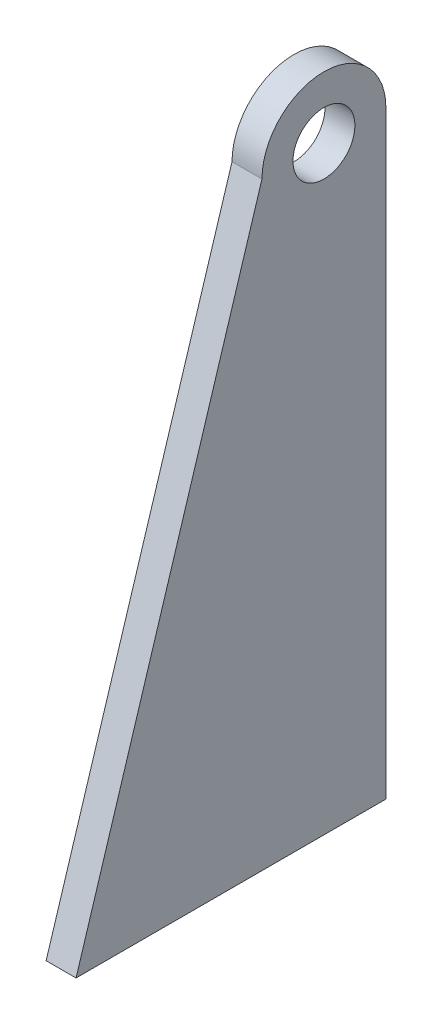
ISO-10303-21;
HEADER;
FILE_DESCRIPTION(('STEP AP214'),'2;1');
FILE_NAME('part.step','',(''),(''),'','','');
FILE_SCHEMA(('AUTOMOTIVE_DESIGN { 1 0 10303 214 1 1 1 1 }'));
ENDSEC;
DATA;
#1=APPLICATION_CONTEXT('core data for automotive mechanical design processes');
#2=APPLICATION_PROTOCOL_DEFINITION('international standard','automotive_design',2000,#1);
#3=PRODUCT_CONTEXT('',#1,'mechanical');
#4=PRODUCT('Part','Part','',(#3));
#5=PRODUCT_RELATED_PRODUCT_CATEGORY('part','',(#4));
#6=PRODUCT_DEFINITION_FORMATION('','',#4);
#7=PRODUCT_DEFINITION_CONTEXT('part definition',#1,'design');
#8=PRODUCT_DEFINITION('design','',#6,#7);
#9=PRODUCT_DEFINITION_SHAPE('','',#8);
#10=(LENGTH_UNIT() NAMED_UNIT(*) SI_UNIT(.MILLI.,.METRE.));
#11=(NAMED_UNIT(*) PLANE_ANGLE_UNIT() SI_UNIT($,.RADIAN.));
#12=(NAMED_UNIT(*) SI_UNIT($,.STERADIAN.) SOLID_ANGLE_UNIT());
#13=UNCERTAINTY_MEASURE_WITH_UNIT(LENGTH_MEASURE(1.E-05),#10,'distance_accuracy_value','');
#14=(GEOMETRIC_REPRESENTATION_CONTEXT(3) GLOBAL_UNCERTAINTY_ASSIGNED_CONTEXT((#13)) GLOBAL_UNIT_ASSIGNED_CONTEXT((#10,
#11,#12)) REPRESENTATION_CONTEXT('',''));
#15=CARTESIAN_POINT('',(0.,0.,0.));
#16=DIRECTION('',(0.,0.,1.));
#17=DIRECTION('',(1.,0.,0.));
#18=AXIS2_PLACEMENT_3D('',#15,#16,#17);
#19=CARTESIAN_POINT('',(5.8,116.,-48.));
#20=DIRECTION('',(1.,0.,0.));
#21=DIRECTION('',(0.,0.,-1.));
#22=AXIS2_PLACEMENT_3D('',#19,#20,#21);
#23=PLANE('',#22);
#24=DIRECTION('',(0.,-0.955064136811237,0.296399214872453));
#25=VECTOR('',#24,1.);
#26=CARTESIAN_POINT('',(5.8,116.,-36.));
#27=LINE('',#26,#25);
#28=CARTESIAN_POINT('',(5.8,116.,-36.));
#29=VERTEX_POINT('',#28);
#30=CARTESIAN_POINT('',(5.8,0.,0.));
#31=VERTEX_POINT('',#30);
#32=EDGE_CURVE('E98',#29,#31,#27,.T.);
#33=ORIENTED_EDGE('',*,*,#32,.T.);
#34=DIRECTION('',(0.,0.,-1.));
#35=VECTOR('',#34,1.);
#36=CARTESIAN_POINT('',(5.8,0.,0.));
#37=LINE('',#36,#35);
#38=CARTESIAN_POINT('',(5.8,0.,-60.));
#39=VERTEX_POINT('',#38);
#40=EDGE_CURVE('E93',#31,#39,#37,.T.);
#41=ORIENTED_EDGE('',*,*,#40,.T.);
#42=DIRECTION('',(0.,1.,0.));
#43=VECTOR('',#42,1.);
#44=CARTESIAN_POINT('',(5.8,0.,-60.));
#45=LINE('',#44,#43);
#46=CARTESIAN_POINT('',(5.8,116.,-60.));
#47=VERTEX_POINT('',#46);
#48=EDGE_CURVE('E96',#39,#47,#45,.T.);
#49=ORIENTED_EDGE('',*,*,#48,.T.);
#50=CARTESIAN_POINT('',(5.8,116.,-48.));
#51=DIRECTION('',(1.,0.,0.));
#52=DIRECTION('',(0.,0.,-1.));
#53=AXIS2_PLACEMENT_3D('',#50,#51,#52);
#54=CIRCLE('',#53,12.);
#55=EDGE_CURVE('E63',#47,#29,#54,.T.);
#56=ORIENTED_EDGE('',*,*,#55,.T.);
#57=EDGE_LOOP('',(#33,#41,#49,#56));
#58=FACE_BOUND('',#57,.T.);
#59=CARTESIAN_POINT('',(5.8,116.,-48.));
#60=DIRECTION('',(1.,0.,0.));
#61=DIRECTION('',(0.,0.,-1.));
#62=AXIS2_PLACEMENT_3D('',#59,#60,#61);
#63=CIRCLE('',#62,6.);
#64=CARTESIAN_POINT('',(5.8,116.,-54.));
#65=VERTEX_POINT('',#64);
#66=EDGE_CURVE('E118',#65,#65,#63,.T.);
#67=ORIENTED_EDGE('',*,*,#66,.F.);
#68=EDGE_LOOP('',(#67));
#69=FACE_BOUND('',#68,.T.);
#70=ADVANCED_FACE('F45',(#58,#69),#23,.T.);
#71=CARTESIAN_POINT('',(0.,116.,-48.));
#72=DIRECTION('',(1.,0.,0.));
#73=DIRECTION('',(0.,0.,-1.));
#74=AXIS2_PLACEMENT_3D('',#71,#72,#73);
#75=PLANE('',#74);
#76=DIRECTION('',(0.,-0.955064136811237,0.296399214872453));
#77=VECTOR('',#76,1.);
#78=CARTESIAN_POINT('',(0.,116.,-36.));
#79=LINE('',#78,#77);
#80=CARTESIAN_POINT('',(0.,116.,-36.));
#81=VERTEX_POINT('',#80);
#82=CARTESIAN_POINT('',(0.,0.,0.));
#83=VERTEX_POINT('',#82);
#84=EDGE_CURVE('E114',#81,#83,#79,.T.);
#85=ORIENTED_EDGE('',*,*,#84,.F.);
#86=CARTESIAN_POINT('',(0.,116.,-48.));
#87=DIRECTION('',(1.,0.,0.));
#88=DIRECTION('',(0.,0.,-1.));
#89=AXIS2_PLACEMENT_3D('',#86,#87,#88);
#90=CIRCLE('',#89,12.);
#91=CARTESIAN_POINT('',(0.,116.,-60.));
#92=VERTEX_POINT('',#91);
#93=EDGE_CURVE('E86',#92,#81,#90,.T.);
#94=ORIENTED_EDGE('',*,*,#93,.F.);
#95=DIRECTION('',(0.,1.,0.));
#96=VECTOR('',#95,1.);
#97=CARTESIAN_POINT('',(0.,0.,-60.));
#98=LINE('',#97,#96);
#99=CARTESIAN_POINT('',(0.,0.,-60.));
#100=VERTEX_POINT('',#99);
#101=EDGE_CURVE('E80',#100,#92,#98,.T.);
#102=ORIENTED_EDGE('',*,*,#101,.F.);
#103=DIRECTION('',(0.,0.,-1.));
#104=VECTOR('',#103,1.);
#105=CARTESIAN_POINT('',(0.,0.,0.));
#106=LINE('',#105,#104);
#107=EDGE_CURVE('E103',#83,#100,#106,.T.);
#108=ORIENTED_EDGE('',*,*,#107,.F.);
#109=EDGE_LOOP('',(#85,#94,#102,#108));
#110=FACE_BOUND('',#109,.T.);
#111=CARTESIAN_POINT('',(0.,116.,-48.));
#112=DIRECTION('',(1.,0.,0.));
#113=DIRECTION('',(0.,0.,-1.));
#114=AXIS2_PLACEMENT_3D('',#111,#112,#113);
#115=CIRCLE('',#114,6.);
#116=CARTESIAN_POINT('',(0.,116.,-54.));
#117=VERTEX_POINT('',#116);
#118=EDGE_CURVE('E136',#117,#117,#115,.T.);
#119=ORIENTED_EDGE('',*,*,#118,.T.);
#120=EDGE_LOOP('',(#119));
#121=FACE_BOUND('',#120,.T.);
#122=ADVANCED_FACE('F131',(#110,#121),#75,.F.);
#123=CARTESIAN_POINT('',(5.8,116.,-36.));
#124=DIRECTION('',(0.,-0.296399214872453,-0.955064136811237));
#125=DIRECTION('',(0.,0.955064136811237,-0.296399214872453));
#126=AXIS2_PLACEMENT_3D('',#123,#124,#125);
#127=PLANE('',#126);
#128=ORIENTED_EDGE('',*,*,#84,.T.);
#129=DIRECTION('',(-1.,0.,0.));
#130=VECTOR('',#129,1.);
#131=CARTESIAN_POINT('',(5.8,0.,0.));
#132=LINE('',#131,#130);
#133=EDGE_CURVE('E11',#31,#83,#132,.T.);
#134=ORIENTED_EDGE('',*,*,#133,.F.);
#135=ORIENTED_EDGE('',*,*,#32,.F.);
#136=DIRECTION('',(-1.,0.,0.));
#137=VECTOR('',#136,1.);
#138=CARTESIAN_POINT('',(5.8,116.,-36.));
#139=LINE('',#138,#137);
#140=EDGE_CURVE('E110',#29,#81,#139,.T.);
#141=ORIENTED_EDGE('',*,*,#140,.T.);
#142=EDGE_LOOP('',(#128,#134,#135,#141));
#143=FACE_BOUND('',#142,.T.);
#144=ADVANCED_FACE('F47',(#143),#127,.F.);
#145=CARTESIAN_POINT('',(5.8,0.,0.));
#146=DIRECTION('',(0.,1.,0.));
#147=DIRECTION('',(0.,0.,1.));
#148=AXIS2_PLACEMENT_3D('',#145,#146,#147);
#149=PLANE('',#148);
#150=ORIENTED_EDGE('',*,*,#107,.T.);
#151=DIRECTION('',(-1.,0.,0.));
#152=VECTOR('',#151,1.);
#153=CARTESIAN_POINT('',(5.8,0.,-60.));
#154=LINE('',#153,#152);
#155=EDGE_CURVE('E55',#39,#100,#154,.T.);
#156=ORIENTED_EDGE('',*,*,#155,.F.);
#157=ORIENTED_EDGE('',*,*,#40,.F.);
#158=ORIENTED_EDGE('',*,*,#133,.T.);
#159=EDGE_LOOP('',(#150,#156,#157,#158));
#160=FACE_BOUND('',#159,.T.);
#161=ADVANCED_FACE('F102',(#160),#149,.F.);
#162=CARTESIAN_POINT('',(5.8,0.,-60.));
#163=DIRECTION('',(0.,0.,1.));
#164=DIRECTION('',(1.,0.,0.));
#165=AXIS2_PLACEMENT_3D('',#162,#163,#164);
#166=PLANE('',#165);
#167=ORIENTED_EDGE('',*,*,#101,.T.);
#168=DIRECTION('',(-1.,0.,0.));
#169=VECTOR('',#168,1.);
#170=CARTESIAN_POINT('',(5.8,116.,-60.));
#171=LINE('',#170,#169);
#172=EDGE_CURVE('E105',#47,#92,#171,.T.);
#173=ORIENTED_EDGE('',*,*,#172,.F.);
#174=ORIENTED_EDGE('',*,*,#48,.F.);
#175=ORIENTED_EDGE('',*,*,#155,.T.);
#176=EDGE_LOOP('',(#167,#173,#174,#175));
#177=FACE_BOUND('',#176,.T.);
#178=ADVANCED_FACE('F106',(#177),#166,.F.);
#179=CARTESIAN_POINT('',(5.8,116.,-48.));
#180=DIRECTION('',(-1.,0.,0.));
#181=DIRECTION('',(0.,0.,1.));
#182=AXIS2_PLACEMENT_3D('',#179,#180,#181);
#183=CYLINDRICAL_SURFACE('',#182,12.);
#184=ORIENTED_EDGE('',*,*,#93,.T.);
#185=ORIENTED_EDGE('',*,*,#140,.F.);
#186=ORIENTED_EDGE('',*,*,#55,.F.);
#187=ORIENTED_EDGE('',*,*,#172,.T.);
#188=EDGE_LOOP('',(#184,#185,#186,#187));
#189=FACE_BOUND('',#188,.T.);
#190=ADVANCED_FACE('F128',(#189),#183,.T.);
#191=CARTESIAN_POINT('',(5.8,116.,-48.));
#192=DIRECTION('',(-1.,0.,0.));
#193=DIRECTION('',(0.,0.,1.));
#194=AXIS2_PLACEMENT_3D('',#191,#192,#193);
#195=CYLINDRICAL_SURFACE('',#194,6.);
#196=ORIENTED_EDGE('',*,*,#66,.T.);
#197=EDGE_LOOP('',(#196));
#198=FACE_BOUND('',#197,.T.);
#199=ORIENTED_EDGE('',*,*,#118,.F.);
#200=EDGE_LOOP('',(#199));
#201=FACE_BOUND('',#200,.T.);
#202=ADVANCED_FACE('F144',(#198,#201),#195,.F.);
#203=CLOSED_SHELL('',(#70,#122,#144,#161,#178,#190,#202));
#204=MANIFOLD_SOLID_BREP('B2',#203);
#205=ADVANCED_BREP_SHAPE_REPRESENTATION('',(#18,#204),#14);
#206=SHAPE_DEFINITION_REPRESENTATION(#9,#205);
ENDSEC;
END-ISO-10303-21;
